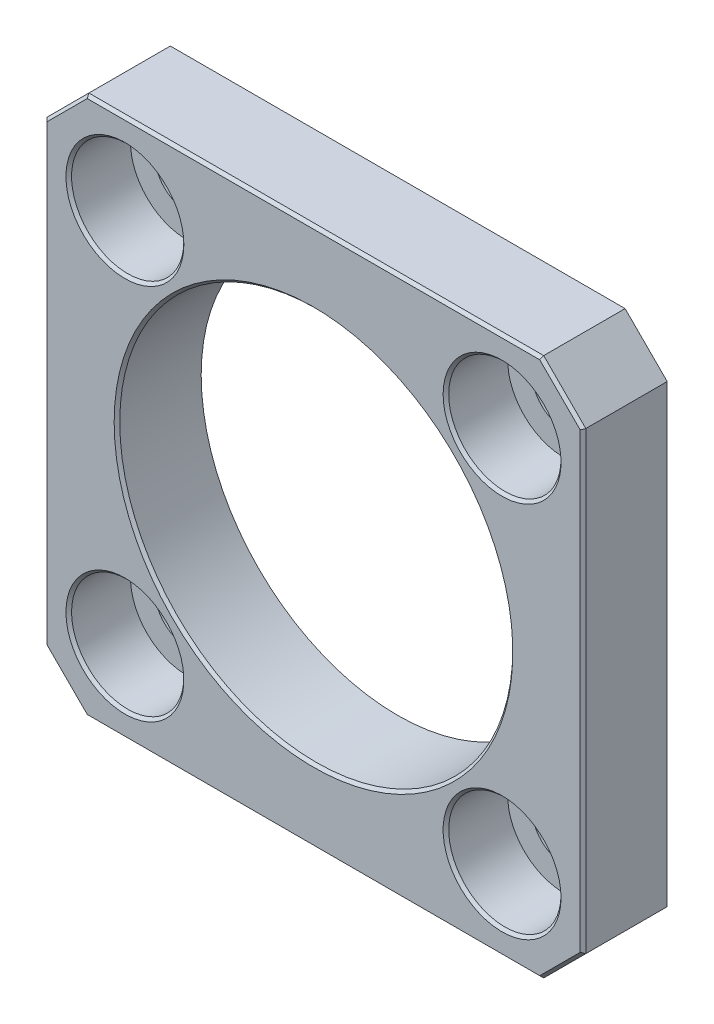
ISO-10303-21;
HEADER;
FILE_DESCRIPTION(('STEP AP214'),'2;1');
FILE_NAME('part.step','',(''),(''),'','','');
FILE_SCHEMA(('AUTOMOTIVE_DESIGN { 1 0 10303 214 1 1 1 1 }'));
ENDSEC;
DATA;
#1=APPLICATION_CONTEXT('core data for automotive mechanical design processes');
#2=APPLICATION_PROTOCOL_DEFINITION('international standard','automotive_design',2000,#1);
#3=PRODUCT_CONTEXT('',#1,'mechanical');
#4=PRODUCT('Part','Part','',(#3));
#5=PRODUCT_RELATED_PRODUCT_CATEGORY('part','',(#4));
#6=PRODUCT_DEFINITION_FORMATION('','',#4);
#7=PRODUCT_DEFINITION_CONTEXT('part definition',#1,'design');
#8=PRODUCT_DEFINITION('design','',#6,#7);
#9=PRODUCT_DEFINITION_SHAPE('','',#8);
#10=(LENGTH_UNIT() NAMED_UNIT(*) SI_UNIT(.MILLI.,.METRE.));
#11=(NAMED_UNIT(*) PLANE_ANGLE_UNIT() SI_UNIT($,.RADIAN.));
#12=(NAMED_UNIT(*) SI_UNIT($,.STERADIAN.) SOLID_ANGLE_UNIT());
#13=UNCERTAINTY_MEASURE_WITH_UNIT(LENGTH_MEASURE(1.E-05),#10,'distance_accuracy_value','');
#14=(GEOMETRIC_REPRESENTATION_CONTEXT(3) GLOBAL_UNCERTAINTY_ASSIGNED_CONTEXT((#13)) GLOBAL_UNIT_ASSIGNED_CONTEXT((#10,
#11,#12)) REPRESENTATION_CONTEXT('',''));
#15=CARTESIAN_POINT('',(0.,0.,0.));
#16=DIRECTION('',(0.,0.,1.));
#17=DIRECTION('',(1.,0.,0.));
#18=AXIS2_PLACEMENT_3D('',#15,#16,#17);
#19=CARTESIAN_POINT('',(0.,0.,6.));
#20=DIRECTION('',(0.,0.,-1.));
#21=DIRECTION('',(-1.,0.,0.));
#22=AXIS2_PLACEMENT_3D('',#19,#20,#21);
#23=PLANE('',#22);
#24=CARTESIAN_POINT('',(0.,0.,6.));
#25=DIRECTION('',(0.,0.,-1.));
#26=DIRECTION('',(-1.,0.,0.));
#27=AXIS2_PLACEMENT_3D('',#24,#25,#26);
#28=CIRCLE('',#27,14.2);
#29=CARTESIAN_POINT('',(-14.2,0.,6.));
#30=VERTEX_POINT('',#29);
#31=EDGE_CURVE('E222',#30,#30,#28,.T.);
#32=ORIENTED_EDGE('',*,*,#31,.T.);
#33=EDGE_LOOP('',(#32));
#34=FACE_BOUND('',#33,.T.);
#35=CARTESIAN_POINT('',(13.4350288425443,13.4350288425445,6.));
#36=DIRECTION('',(0.,0.,-1.));
#37=DIRECTION('',(-1.,0.,0.));
#38=AXIS2_PLACEMENT_3D('',#35,#36,#37);
#39=CIRCLE('',#38,4.19999999999998);
#40=CARTESIAN_POINT('',(9.23502884254428,13.4350288425445,6.));
#41=VERTEX_POINT('',#40);
#42=EDGE_CURVE('E219',#41,#41,#39,.T.);
#43=ORIENTED_EDGE('',*,*,#42,.T.);
#44=EDGE_LOOP('',(#43));
#45=FACE_BOUND('',#44,.T.);
#46=CARTESIAN_POINT('',(13.4350288425444,-13.4350288425444,6.));
#47=DIRECTION('',(0.,0.,-1.));
#48=DIRECTION('',(-1.,0.,0.));
#49=AXIS2_PLACEMENT_3D('',#46,#47,#48);
#50=CIRCLE('',#49,4.19999999999999);
#51=CARTESIAN_POINT('',(17.6350288425444,-13.4350288425444,6.));
#52=VERTEX_POINT('',#51);
#53=EDGE_CURVE('E216',#52,#52,#50,.T.);
#54=ORIENTED_EDGE('',*,*,#53,.T.);
#55=EDGE_LOOP('',(#54));
#56=FACE_BOUND('',#55,.T.);
#57=CARTESIAN_POINT('',(-13.4350288425444,-13.4350288425445,6.));
#58=DIRECTION('',(0.,0.,-1.));
#59=DIRECTION('',(-1.,0.,0.));
#60=AXIS2_PLACEMENT_3D('',#57,#58,#59);
#61=CIRCLE('',#60,4.19999999999998);
#62=CARTESIAN_POINT('',(-17.6350288425443,-13.4350288425445,6.));
#63=VERTEX_POINT('',#62);
#64=EDGE_CURVE('E213',#63,#63,#61,.T.);
#65=ORIENTED_EDGE('',*,*,#64,.T.);
#66=EDGE_LOOP('',(#65));
#67=FACE_BOUND('',#66,.T.);
#68=CARTESIAN_POINT('',(-13.4350288425444,13.4350288425444,6.));
#69=DIRECTION('',(0.,0.,-1.));
#70=DIRECTION('',(-1.,0.,0.));
#71=AXIS2_PLACEMENT_3D('',#68,#69,#70);
#72=CIRCLE('',#71,4.19999999999999);
#73=CARTESIAN_POINT('',(-9.23502884254442,13.4350288425444,6.));
#74=VERTEX_POINT('',#73);
#75=EDGE_CURVE('E210',#74,#74,#72,.T.);
#76=ORIENTED_EDGE('',*,*,#75,.T.);
#77=EDGE_LOOP('',(#76));
#78=FACE_BOUND('',#77,.T.);
#79=DIRECTION('',(0.,-1.,0.));
#80=VECTOR('',#79,1.);
#81=CARTESIAN_POINT('',(-19.,0.,6.));
#82=LINE('',#81,#80);
#83=CARTESIAN_POINT('',(-19.,16.1171572875254,6.));
#84=VERTEX_POINT('',#83);
#85=CARTESIAN_POINT('',(-19.,-16.1171572875254,6.));
#86=VERTEX_POINT('',#85);
#87=EDGE_CURVE('E205',#84,#86,#82,.T.);
#88=ORIENTED_EDGE('',*,*,#87,.T.);
#89=DIRECTION('',(0.707106781186548,-0.707106781186548,0.));
#90=VECTOR('',#89,1.);
#91=CARTESIAN_POINT('',(-17.5585786437627,-17.5585786437627,6.));
#92=LINE('',#91,#90);
#93=CARTESIAN_POINT('',(-16.1171572875254,-19.,6.));
#94=VERTEX_POINT('',#93);
#95=EDGE_CURVE('E207',#86,#94,#92,.T.);
#96=ORIENTED_EDGE('',*,*,#95,.T.);
#97=DIRECTION('',(1.,0.,0.));
#98=VECTOR('',#97,1.);
#99=CARTESIAN_POINT('',(0.,-19.,6.));
#100=LINE('',#99,#98);
#101=CARTESIAN_POINT('',(16.1171572875254,-19.,6.));
#102=VERTEX_POINT('',#101);
#103=EDGE_CURVE('E201',#94,#102,#100,.T.);
#104=ORIENTED_EDGE('',*,*,#103,.T.);
#105=DIRECTION('',(0.707106781186548,0.707106781186548,0.));
#106=VECTOR('',#105,1.);
#107=CARTESIAN_POINT('',(17.5585786437627,-17.5585786437627,6.));
#108=LINE('',#107,#106);
#109=CARTESIAN_POINT('',(19.,-16.1171572875254,6.));
#110=VERTEX_POINT('',#109);
#111=EDGE_CURVE('E199',#102,#110,#108,.T.);
#112=ORIENTED_EDGE('',*,*,#111,.T.);
#113=DIRECTION('',(0.,1.,0.));
#114=VECTOR('',#113,1.);
#115=CARTESIAN_POINT('',(19.,0.,6.));
#116=LINE('',#115,#114);
#117=CARTESIAN_POINT('',(19.,16.1171572875254,6.));
#118=VERTEX_POINT('',#117);
#119=EDGE_CURVE('E197',#110,#118,#116,.T.);
#120=ORIENTED_EDGE('',*,*,#119,.T.);
#121=DIRECTION('',(-0.707106781186548,0.707106781186548,0.));
#122=VECTOR('',#121,1.);
#123=CARTESIAN_POINT('',(17.5585786437627,17.5585786437627,6.));
#124=LINE('',#123,#122);
#125=CARTESIAN_POINT('',(16.1171572875254,19.,6.));
#126=VERTEX_POINT('',#125);
#127=EDGE_CURVE('E195',#118,#126,#124,.T.);
#128=ORIENTED_EDGE('',*,*,#127,.T.);
#129=DIRECTION('',(-1.,0.,0.));
#130=VECTOR('',#129,1.);
#131=CARTESIAN_POINT('',(0.,19.,6.));
#132=LINE('',#131,#130);
#133=CARTESIAN_POINT('',(-16.1171572875254,19.,6.));
#134=VERTEX_POINT('',#133);
#135=EDGE_CURVE('E193',#126,#134,#132,.T.);
#136=ORIENTED_EDGE('',*,*,#135,.T.);
#137=DIRECTION('',(-0.707106781186548,-0.707106781186548,0.));
#138=VECTOR('',#137,1.);
#139=CARTESIAN_POINT('',(-17.5585786437627,17.5585786437627,6.));
#140=LINE('',#139,#138);
#141=EDGE_CURVE('E203',#134,#84,#140,.T.);
#142=ORIENTED_EDGE('',*,*,#141,.T.);
#143=EDGE_LOOP('',(#88,#96,#104,#112,#120,#128,#136,#142));
#144=FACE_BOUND('',#143,.T.);
#145=ADVANCED_FACE('F39',(#34,#45,#56,#67,#78,#144),#23,.F.);
#146=CARTESIAN_POINT('',(0.,0.,0.));
#147=DIRECTION('',(0.,0.,-1.));
#148=DIRECTION('',(-1.,0.,0.));
#149=AXIS2_PLACEMENT_3D('',#146,#147,#148);
#150=PLANE('',#149);
#151=CARTESIAN_POINT('',(13.4350288425443,13.4350288425445,0.));
#152=DIRECTION('',(0.,0.,1.));
#153=DIRECTION('',(1.,0.,0.));
#154=AXIS2_PLACEMENT_3D('',#151,#152,#153);
#155=CIRCLE('',#154,2.25);
#156=CARTESIAN_POINT('',(15.6850288425443,13.4350288425445,0.));
#157=VERTEX_POINT('',#156);
#158=EDGE_CURVE('E281',#157,#157,#155,.T.);
#159=ORIENTED_EDGE('',*,*,#158,.T.);
#160=EDGE_LOOP('',(#159));
#161=FACE_BOUND('',#160,.T.);
#162=CARTESIAN_POINT('',(13.4350288425444,-13.4350288425444,0.));
#163=DIRECTION('',(0.,0.,1.));
#164=DIRECTION('',(1.,0.,0.));
#165=AXIS2_PLACEMENT_3D('',#162,#163,#164);
#166=CIRCLE('',#165,2.25);
#167=CARTESIAN_POINT('',(15.6850288425444,-13.4350288425444,0.));
#168=VERTEX_POINT('',#167);
#169=EDGE_CURVE('E292',#168,#168,#166,.T.);
#170=ORIENTED_EDGE('',*,*,#169,.T.);
#171=EDGE_LOOP('',(#170));
#172=FACE_BOUND('',#171,.T.);
#173=CARTESIAN_POINT('',(-13.4350288425444,-13.4350288425445,0.));
#174=DIRECTION('',(0.,0.,1.));
#175=DIRECTION('',(1.,0.,0.));
#176=AXIS2_PLACEMENT_3D('',#173,#174,#175);
#177=CIRCLE('',#176,2.25);
#178=CARTESIAN_POINT('',(-11.1850288425444,-13.4350288425445,0.));
#179=VERTEX_POINT('',#178);
#180=EDGE_CURVE('E301',#179,#179,#177,.T.);
#181=ORIENTED_EDGE('',*,*,#180,.T.);
#182=EDGE_LOOP('',(#181));
#183=FACE_BOUND('',#182,.T.);
#184=CARTESIAN_POINT('',(-13.4350288425444,13.4350288425444,0.));
#185=DIRECTION('',(0.,0.,1.));
#186=DIRECTION('',(1.,0.,0.));
#187=AXIS2_PLACEMENT_3D('',#184,#185,#186);
#188=CIRCLE('',#187,2.25);
#189=CARTESIAN_POINT('',(-11.1850288425444,13.4350288425444,0.));
#190=VERTEX_POINT('',#189);
#191=EDGE_CURVE('E160',#190,#190,#188,.T.);
#192=ORIENTED_EDGE('',*,*,#191,.T.);
#193=EDGE_LOOP('',(#192));
#194=FACE_BOUND('',#193,.T.);
#195=DIRECTION('',(0.,-1.,0.));
#196=VECTOR('',#195,1.);
#197=CARTESIAN_POINT('',(-19.2,-16.2,0.));
#198=LINE('',#197,#196);
#199=CARTESIAN_POINT('',(-19.2,16.2,0.));
#200=VERTEX_POINT('',#199);
#201=CARTESIAN_POINT('',(-19.2,-16.2,0.));
#202=VERTEX_POINT('',#201);
#203=EDGE_CURVE('E148',#200,#202,#198,.T.);
#204=ORIENTED_EDGE('',*,*,#203,.F.);
#205=DIRECTION('',(-0.707106781186548,-0.707106781186548,0.));
#206=VECTOR('',#205,1.);
#207=CARTESIAN_POINT('',(-19.2,16.2,0.));
#208=LINE('',#207,#206);
#209=CARTESIAN_POINT('',(-16.2,19.2,0.));
#210=VERTEX_POINT('',#209);
#211=EDGE_CURVE('E177',#210,#200,#208,.T.);
#212=ORIENTED_EDGE('',*,*,#211,.F.);
#213=DIRECTION('',(-1.,0.,0.));
#214=VECTOR('',#213,1.);
#215=CARTESIAN_POINT('',(-16.2,19.2,0.));
#216=LINE('',#215,#214);
#217=CARTESIAN_POINT('',(16.2,19.2,0.));
#218=VERTEX_POINT('',#217);
#219=EDGE_CURVE('E174',#218,#210,#216,.T.);
#220=ORIENTED_EDGE('',*,*,#219,.F.);
#221=DIRECTION('',(-0.707106781186548,0.707106781186548,0.));
#222=VECTOR('',#221,1.);
#223=CARTESIAN_POINT('',(16.2,19.2,0.));
#224=LINE('',#223,#222);
#225=CARTESIAN_POINT('',(19.2,16.2,0.));
#226=VERTEX_POINT('',#225);
#227=EDGE_CURVE('E171',#226,#218,#224,.T.);
#228=ORIENTED_EDGE('',*,*,#227,.F.);
#229=DIRECTION('',(0.,1.,0.));
#230=VECTOR('',#229,1.);
#231=CARTESIAN_POINT('',(19.2,-16.2,0.));
#232=LINE('',#231,#230);
#233=CARTESIAN_POINT('',(19.2,-16.2,0.));
#234=VERTEX_POINT('',#233);
#235=EDGE_CURVE('E168',#234,#226,#232,.T.);
#236=ORIENTED_EDGE('',*,*,#235,.F.);
#237=DIRECTION('',(0.707106781186548,0.707106781186548,0.));
#238=VECTOR('',#237,1.);
#239=CARTESIAN_POINT('',(16.2,-19.2,0.));
#240=LINE('',#239,#238);
#241=CARTESIAN_POINT('',(16.2,-19.2,0.));
#242=VERTEX_POINT('',#241);
#243=EDGE_CURVE('E165',#242,#234,#240,.T.);
#244=ORIENTED_EDGE('',*,*,#243,.F.);
#245=DIRECTION('',(1.,0.,0.));
#246=VECTOR('',#245,1.);
#247=CARTESIAN_POINT('',(-16.2,-19.2,0.));
#248=LINE('',#247,#246);
#249=CARTESIAN_POINT('',(-16.2,-19.2,0.));
#250=VERTEX_POINT('',#249);
#251=EDGE_CURVE('E151',#250,#242,#248,.T.);
#252=ORIENTED_EDGE('',*,*,#251,.F.);
#253=DIRECTION('',(0.707106781186548,-0.707106781186548,0.));
#254=VECTOR('',#253,1.);
#255=CARTESIAN_POINT('',(-16.2,-19.2,0.));
#256=LINE('',#255,#254);
#257=EDGE_CURVE('E134',#202,#250,#256,.T.);
#258=ORIENTED_EDGE('',*,*,#257,.F.);
#259=EDGE_LOOP('',(#204,#212,#220,#228,#236,#244,#252,#258));
#260=FACE_BOUND('',#259,.T.);
#261=CARTESIAN_POINT('',(0.,0.,0.));
#262=DIRECTION('',(0.,0.,1.));
#263=DIRECTION('',(1.,0.,0.));
#264=AXIS2_PLACEMENT_3D('',#261,#262,#263);
#265=CIRCLE('',#264,14.);
#266=CARTESIAN_POINT('',(14.,0.,0.));
#267=VERTEX_POINT('',#266);
#268=EDGE_CURVE('E157',#267,#267,#265,.T.);
#269=ORIENTED_EDGE('',*,*,#268,.T.);
#270=EDGE_LOOP('',(#269));
#271=FACE_BOUND('',#270,.T.);
#272=ADVANCED_FACE('F145',(#161,#172,#183,#194,#260,#271),#150,.T.);
#273=CARTESIAN_POINT('',(-19.2,-16.2,6.));
#274=DIRECTION('',(1.,0.,0.));
#275=DIRECTION('',(0.,0.,-1.));
#276=AXIS2_PLACEMENT_3D('',#273,#274,#275);
#277=PLANE('',#276);
#278=DIRECTION('',(0.,0.,-1.));
#279=VECTOR('',#278,1.);
#280=CARTESIAN_POINT('',(-19.2,-16.2,6.));
#281=LINE('',#280,#279);
#282=CARTESIAN_POINT('',(-19.2,-16.2,5.8));
#283=VERTEX_POINT('',#282);
#284=EDGE_CURVE('E130',#283,#202,#281,.T.);
#285=ORIENTED_EDGE('',*,*,#284,.F.);
#286=DIRECTION('',(0.,1.,0.));
#287=VECTOR('',#286,1.);
#288=CARTESIAN_POINT('',(-19.2,-16.2,5.8));
#289=LINE('',#288,#287);
#290=CARTESIAN_POINT('',(-19.2,16.2,5.8));
#291=VERTEX_POINT('',#290);
#292=EDGE_CURVE('E238',#283,#291,#289,.T.);
#293=ORIENTED_EDGE('',*,*,#292,.T.);
#294=DIRECTION('',(0.,0.,-1.));
#295=VECTOR('',#294,1.);
#296=CARTESIAN_POINT('',(-19.2,16.2,6.));
#297=LINE('',#296,#295);
#298=EDGE_CURVE('E155',#291,#200,#297,.T.);
#299=ORIENTED_EDGE('',*,*,#298,.T.);
#300=ORIENTED_EDGE('',*,*,#203,.T.);
#301=EDGE_LOOP('',(#285,#293,#299,#300));
#302=FACE_BOUND('',#301,.T.);
#303=ADVANCED_FACE('F153',(#302),#277,.F.);
#304=CARTESIAN_POINT('',(-16.2,-19.2,6.));
#305=DIRECTION('',(0.707106781186547,0.707106781186547,0.));
#306=DIRECTION('',(-0.707106781186548,0.707106781186548,0.));
#307=AXIS2_PLACEMENT_3D('',#304,#305,#306);
#308=PLANE('',#307);
#309=DIRECTION('',(0.,0.,-1.));
#310=VECTOR('',#309,1.);
#311=CARTESIAN_POINT('',(-16.2,-19.2,6.));
#312=LINE('',#311,#310);
#313=CARTESIAN_POINT('',(-16.2,-19.2,5.8));
#314=VERTEX_POINT('',#313);
#315=EDGE_CURVE('E141',#314,#250,#312,.T.);
#316=ORIENTED_EDGE('',*,*,#315,.F.);
#317=DIRECTION('',(-0.707106781186548,0.707106781186548,0.));
#318=VECTOR('',#317,1.);
#319=CARTESIAN_POINT('',(-16.2,-19.2,5.8));
#320=LINE('',#319,#318);
#321=EDGE_CURVE('E137',#314,#283,#320,.T.);
#322=ORIENTED_EDGE('',*,*,#321,.T.);
#323=ORIENTED_EDGE('',*,*,#284,.T.);
#324=ORIENTED_EDGE('',*,*,#257,.T.);
#325=EDGE_LOOP('',(#316,#322,#323,#324));
#326=FACE_BOUND('',#325,.T.);
#327=ADVANCED_FACE('F133',(#326),#308,.F.);
#328=CARTESIAN_POINT('',(-16.2,-19.2,6.));
#329=DIRECTION('',(0.,1.,0.));
#330=DIRECTION('',(0.,0.,1.));
#331=AXIS2_PLACEMENT_3D('',#328,#329,#330);
#332=PLANE('',#331);
#333=DIRECTION('',(0.,0.,-1.));
#334=VECTOR('',#333,1.);
#335=CARTESIAN_POINT('',(16.2,-19.2,6.));
#336=LINE('',#335,#334);
#337=CARTESIAN_POINT('',(16.2,-19.2,5.8));
#338=VERTEX_POINT('',#337);
#339=EDGE_CURVE('E188',#338,#242,#336,.T.);
#340=ORIENTED_EDGE('',*,*,#339,.F.);
#341=DIRECTION('',(-1.,0.,0.));
#342=VECTOR('',#341,1.);
#343=CARTESIAN_POINT('',(-16.2,-19.2,5.8));
#344=LINE('',#343,#342);
#345=EDGE_CURVE('E242',#338,#314,#344,.T.);
#346=ORIENTED_EDGE('',*,*,#345,.T.);
#347=ORIENTED_EDGE('',*,*,#315,.T.);
#348=ORIENTED_EDGE('',*,*,#251,.T.);
#349=EDGE_LOOP('',(#340,#346,#347,#348));
#350=FACE_BOUND('',#349,.T.);
#351=ADVANCED_FACE('F369',(#350),#332,.F.);
#352=CARTESIAN_POINT('',(16.2,-19.2,6.));
#353=DIRECTION('',(-0.707106781186547,0.707106781186547,0.));
#354=DIRECTION('',(-0.707106781186548,-0.707106781186548,0.));
#355=AXIS2_PLACEMENT_3D('',#352,#353,#354);
#356=PLANE('',#355);
#357=DIRECTION('',(0.,0.,-1.));
#358=VECTOR('',#357,1.);
#359=CARTESIAN_POINT('',(19.2,-16.2,6.));
#360=LINE('',#359,#358);
#361=CARTESIAN_POINT('',(19.2,-16.2,5.8));
#362=VERTEX_POINT('',#361);
#363=EDGE_CURVE('E186',#362,#234,#360,.T.);
#364=ORIENTED_EDGE('',*,*,#363,.F.);
#365=DIRECTION('',(-0.707106781186548,-0.707106781186548,0.));
#366=VECTOR('',#365,1.);
#367=CARTESIAN_POINT('',(16.2,-19.2,5.8));
#368=LINE('',#367,#366);
#369=EDGE_CURVE('E244',#362,#338,#368,.T.);
#370=ORIENTED_EDGE('',*,*,#369,.T.);
#371=ORIENTED_EDGE('',*,*,#339,.T.);
#372=ORIENTED_EDGE('',*,*,#243,.T.);
#373=EDGE_LOOP('',(#364,#370,#371,#372));
#374=FACE_BOUND('',#373,.T.);
#375=ADVANCED_FACE('F365',(#374),#356,.F.);
#376=CARTESIAN_POINT('',(19.2,-16.2,6.));
#377=DIRECTION('',(-1.,0.,0.));
#378=DIRECTION('',(0.,0.,1.));
#379=AXIS2_PLACEMENT_3D('',#376,#377,#378);
#380=PLANE('',#379);
#381=DIRECTION('',(0.,0.,-1.));
#382=VECTOR('',#381,1.);
#383=CARTESIAN_POINT('',(19.2,16.2,6.));
#384=LINE('',#383,#382);
#385=CARTESIAN_POINT('',(19.2,16.2,5.8));
#386=VERTEX_POINT('',#385);
#387=EDGE_CURVE('E184',#386,#226,#384,.T.);
#388=ORIENTED_EDGE('',*,*,#387,.F.);
#389=DIRECTION('',(0.,-1.,0.));
#390=VECTOR('',#389,1.);
#391=CARTESIAN_POINT('',(19.2,-16.2,5.8));
#392=LINE('',#391,#390);
#393=EDGE_CURVE('E246',#386,#362,#392,.T.);
#394=ORIENTED_EDGE('',*,*,#393,.T.);
#395=ORIENTED_EDGE('',*,*,#363,.T.);
#396=ORIENTED_EDGE('',*,*,#235,.T.);
#397=EDGE_LOOP('',(#388,#394,#395,#396));
#398=FACE_BOUND('',#397,.T.);
#399=ADVANCED_FACE('F362',(#398),#380,.F.);
#400=CARTESIAN_POINT('',(16.2,19.2,6.));
#401=DIRECTION('',(-0.707106781186547,-0.707106781186547,0.));
#402=DIRECTION('',(0.707106781186548,-0.707106781186548,0.));
#403=AXIS2_PLACEMENT_3D('',#400,#401,#402);
#404=PLANE('',#403);
#405=DIRECTION('',(0.,0.,-1.));
#406=VECTOR('',#405,1.);
#407=CARTESIAN_POINT('',(16.2,19.2,6.));
#408=LINE('',#407,#406);
#409=CARTESIAN_POINT('',(16.2,19.2,5.8));
#410=VERTEX_POINT('',#409);
#411=EDGE_CURVE('E182',#410,#218,#408,.T.);
#412=ORIENTED_EDGE('',*,*,#411,.F.);
#413=DIRECTION('',(0.707106781186548,-0.707106781186548,0.));
#414=VECTOR('',#413,1.);
#415=CARTESIAN_POINT('',(16.2,19.2,5.8));
#416=LINE('',#415,#414);
#417=EDGE_CURVE('E49',#410,#386,#416,.T.);
#418=ORIENTED_EDGE('',*,*,#417,.T.);
#419=ORIENTED_EDGE('',*,*,#387,.T.);
#420=ORIENTED_EDGE('',*,*,#227,.T.);
#421=EDGE_LOOP('',(#412,#418,#419,#420));
#422=FACE_BOUND('',#421,.T.);
#423=ADVANCED_FACE('F359',(#422),#404,.F.);
#424=CARTESIAN_POINT('',(-16.2,19.2,6.));
#425=DIRECTION('',(0.,-1.,0.));
#426=DIRECTION('',(0.,0.,-1.));
#427=AXIS2_PLACEMENT_3D('',#424,#425,#426);
#428=PLANE('',#427);
#429=DIRECTION('',(0.,0.,-1.));
#430=VECTOR('',#429,1.);
#431=CARTESIAN_POINT('',(-16.2,19.2,6.));
#432=LINE('',#431,#430);
#433=CARTESIAN_POINT('',(-16.2,19.2,5.8));
#434=VERTEX_POINT('',#433);
#435=EDGE_CURVE('E180',#434,#210,#432,.T.);
#436=ORIENTED_EDGE('',*,*,#435,.F.);
#437=DIRECTION('',(1.,0.,0.));
#438=VECTOR('',#437,1.);
#439=CARTESIAN_POINT('',(-16.2,19.2,5.8));
#440=LINE('',#439,#438);
#441=EDGE_CURVE('E11',#434,#410,#440,.T.);
#442=ORIENTED_EDGE('',*,*,#441,.T.);
#443=ORIENTED_EDGE('',*,*,#411,.T.);
#444=ORIENTED_EDGE('',*,*,#219,.T.);
#445=EDGE_LOOP('',(#436,#442,#443,#444));
#446=FACE_BOUND('',#445,.T.);
#447=ADVANCED_FACE('F355',(#446),#428,.F.);
#448=CARTESIAN_POINT('',(-19.2,16.2,6.));
#449=DIRECTION('',(0.707106781186547,-0.707106781186547,0.));
#450=DIRECTION('',(0.707106781186548,0.707106781186548,0.));
#451=AXIS2_PLACEMENT_3D('',#448,#449,#450);
#452=PLANE('',#451);
#453=ORIENTED_EDGE('',*,*,#298,.F.);
#454=DIRECTION('',(0.707106781186548,0.707106781186548,0.));
#455=VECTOR('',#454,1.);
#456=CARTESIAN_POINT('',(-19.2,16.2,5.8));
#457=LINE('',#456,#455);
#458=EDGE_CURVE('E240',#291,#434,#457,.T.);
#459=ORIENTED_EDGE('',*,*,#458,.T.);
#460=ORIENTED_EDGE('',*,*,#435,.T.);
#461=ORIENTED_EDGE('',*,*,#211,.T.);
#462=EDGE_LOOP('',(#453,#459,#460,#461));
#463=FACE_BOUND('',#462,.T.);
#464=ADVANCED_FACE('F352',(#463),#452,.F.);
#465=CARTESIAN_POINT('',(0.,0.,6.));
#466=DIRECTION('',(0.,0.,-1.));
#467=DIRECTION('',(-1.,0.,0.));
#468=AXIS2_PLACEMENT_3D('',#465,#466,#467);
#469=CYLINDRICAL_SURFACE('',#468,14.);
#470=CARTESIAN_POINT('',(0.,0.,5.80000000000002));
#471=DIRECTION('',(0.,0.,-1.));
#472=DIRECTION('',(-1.,0.,0.));
#473=AXIS2_PLACEMENT_3D('',#470,#471,#472);
#474=CIRCLE('',#473,14.);
#475=CARTESIAN_POINT('',(-14.,0.,5.80000000000002));
#476=VERTEX_POINT('',#475);
#477=EDGE_CURVE('E140',#476,#476,#474,.F.);
#478=ORIENTED_EDGE('',*,*,#477,.T.);
#479=EDGE_LOOP('',(#478));
#480=FACE_BOUND('',#479,.T.);
#481=ORIENTED_EDGE('',*,*,#268,.F.);
#482=EDGE_LOOP('',(#481));
#483=FACE_BOUND('',#482,.T.);
#484=ADVANCED_FACE('F317',(#480,#483),#469,.F.);
#485=CARTESIAN_POINT('',(-13.4350288425444,13.4350288425444,6.));
#486=DIRECTION('',(0.,0.,1.));
#487=DIRECTION('',(1.,0.,0.));
#488=AXIS2_PLACEMENT_3D('',#485,#486,#487);
#489=CYLINDRICAL_SURFACE('',#488,2.25);
#490=ORIENTED_EDGE('',*,*,#191,.F.);
#491=EDGE_LOOP('',(#490));
#492=FACE_BOUND('',#491,.T.);
#493=CARTESIAN_POINT('',(-13.4350288425444,13.4350288425444,1.6));
#494=DIRECTION('',(0.,0.,1.));
#495=DIRECTION('',(1.,0.,0.));
#496=AXIS2_PLACEMENT_3D('',#493,#494,#495);
#497=CIRCLE('',#496,2.25);
#498=CARTESIAN_POINT('',(-11.1850288425444,13.4350288425444,1.6));
#499=VERTEX_POINT('',#498);
#500=EDGE_CURVE('E307',#499,#499,#497,.T.);
#501=ORIENTED_EDGE('',*,*,#500,.T.);
#502=EDGE_LOOP('',(#501));
#503=FACE_BOUND('',#502,.T.);
#504=ADVANCED_FACE('F313',(#492,#503),#489,.F.);
#505=CARTESIAN_POINT('',(-11.1850288425444,13.4350288425444,1.6));
#506=DIRECTION('',(0.,0.,-1.));
#507=DIRECTION('',(-1.,0.,0.));
#508=AXIS2_PLACEMENT_3D('',#505,#506,#507);
#509=PLANE('',#508);
#510=ORIENTED_EDGE('',*,*,#500,.F.);
#511=EDGE_LOOP('',(#510));
#512=FACE_BOUND('',#511,.T.);
#513=CARTESIAN_POINT('',(-13.4350288425444,13.4350288425444,1.6));
#514=DIRECTION('',(0.,0.,1.));
#515=DIRECTION('',(1.,0.,0.));
#516=AXIS2_PLACEMENT_3D('',#513,#514,#515);
#517=CIRCLE('',#516,4.);
#518=CARTESIAN_POINT('',(-9.43502884254441,13.4350288425444,1.6));
#519=VERTEX_POINT('',#518);
#520=EDGE_CURVE('E304',#519,#519,#517,.T.);
#521=ORIENTED_EDGE('',*,*,#520,.T.);
#522=EDGE_LOOP('',(#521));
#523=FACE_BOUND('',#522,.T.);
#524=ADVANCED_FACE('F316',(#512,#523),#509,.F.);
#525=CARTESIAN_POINT('',(-13.4350288425444,13.4350288425444,6.));
#526=DIRECTION('',(0.,0.,1.));
#527=DIRECTION('',(1.,0.,0.));
#528=AXIS2_PLACEMENT_3D('',#525,#526,#527);
#529=CYLINDRICAL_SURFACE('',#528,3.99999999999999);
#530=CARTESIAN_POINT('',(-13.4350288425444,13.4350288425444,5.80000000000001));
#531=DIRECTION('',(0.,0.,-1.));
#532=DIRECTION('',(-1.,0.,0.));
#533=AXIS2_PLACEMENT_3D('',#530,#531,#532);
#534=CIRCLE('',#533,3.99999999999999);
#535=CARTESIAN_POINT('',(-9.43502884254441,13.4350288425444,5.80000000000001));
#536=VERTEX_POINT('',#535);
#537=EDGE_CURVE('E234',#536,#536,#534,.F.);
#538=ORIENTED_EDGE('',*,*,#537,.T.);
#539=EDGE_LOOP('',(#538));
#540=FACE_BOUND('',#539,.T.);
#541=ORIENTED_EDGE('',*,*,#520,.F.);
#542=EDGE_LOOP('',(#541));
#543=FACE_BOUND('',#542,.T.);
#544=ADVANCED_FACE('F323',(#540,#543),#529,.F.);
#545=CARTESIAN_POINT('',(-13.4350288425444,-13.4350288425445,6.));
#546=DIRECTION('',(0.,0.,1.));
#547=DIRECTION('',(1.,0.,0.));
#548=AXIS2_PLACEMENT_3D('',#545,#546,#547);
#549=CYLINDRICAL_SURFACE('',#548,2.25);
#550=ORIENTED_EDGE('',*,*,#180,.F.);
#551=EDGE_LOOP('',(#550));
#552=FACE_BOUND('',#551,.T.);
#553=CARTESIAN_POINT('',(-13.4350288425444,-13.4350288425445,1.6));
#554=DIRECTION('',(0.,0.,1.));
#555=DIRECTION('',(1.,0.,0.));
#556=AXIS2_PLACEMENT_3D('',#553,#554,#555);
#557=CIRCLE('',#556,2.25);
#558=CARTESIAN_POINT('',(-11.1850288425444,-13.4350288425445,1.6));
#559=VERTEX_POINT('',#558);
#560=EDGE_CURVE('E298',#559,#559,#557,.T.);
#561=ORIENTED_EDGE('',*,*,#560,.T.);
#562=EDGE_LOOP('',(#561));
#563=FACE_BOUND('',#562,.T.);
#564=ADVANCED_FACE('F328',(#552,#563),#549,.F.);
#565=CARTESIAN_POINT('',(-11.1850288425444,-13.4350288425445,1.6));
#566=DIRECTION('',(0.,0.,-1.));
#567=DIRECTION('',(-1.,0.,0.));
#568=AXIS2_PLACEMENT_3D('',#565,#566,#567);
#569=PLANE('',#568);
#570=ORIENTED_EDGE('',*,*,#560,.F.);
#571=EDGE_LOOP('',(#570));
#572=FACE_BOUND('',#571,.T.);
#573=CARTESIAN_POINT('',(-13.4350288425444,-13.4350288425445,1.6));
#574=DIRECTION('',(0.,0.,1.));
#575=DIRECTION('',(1.,0.,0.));
#576=AXIS2_PLACEMENT_3D('',#573,#574,#575);
#577=CIRCLE('',#576,4.);
#578=CARTESIAN_POINT('',(-9.43502884254436,-13.4350288425445,1.6));
#579=VERTEX_POINT('',#578);
#580=EDGE_CURVE('E295',#579,#579,#577,.T.);
#581=ORIENTED_EDGE('',*,*,#580,.T.);
#582=EDGE_LOOP('',(#581));
#583=FACE_BOUND('',#582,.T.);
#584=ADVANCED_FACE('F336',(#572,#583),#569,.F.);
#585=CARTESIAN_POINT('',(-13.4350288425444,-13.4350288425445,6.));
#586=DIRECTION('',(0.,0.,1.));
#587=DIRECTION('',(1.,0.,0.));
#588=AXIS2_PLACEMENT_3D('',#585,#586,#587);
#589=CYLINDRICAL_SURFACE('',#588,3.99999999999999);
#590=CARTESIAN_POINT('',(-13.4350288425444,-13.4350288425445,5.80000000000001));
#591=DIRECTION('',(0.,0.,-1.));
#592=DIRECTION('',(-1.,0.,0.));
#593=AXIS2_PLACEMENT_3D('',#590,#591,#592);
#594=CIRCLE('',#593,3.99999999999999);
#595=CARTESIAN_POINT('',(-17.4350288425444,-13.4350288425445,5.80000000000001));
#596=VERTEX_POINT('',#595);
#597=EDGE_CURVE('E231',#596,#596,#594,.F.);
#598=ORIENTED_EDGE('',*,*,#597,.T.);
#599=EDGE_LOOP('',(#598));
#600=FACE_BOUND('',#599,.T.);
#601=ORIENTED_EDGE('',*,*,#580,.F.);
#602=EDGE_LOOP('',(#601));
#603=FACE_BOUND('',#602,.T.);
#604=ADVANCED_FACE('F555',(#600,#603),#589,.F.);
#605=CARTESIAN_POINT('',(13.4350288425444,-13.4350288425444,6.));
#606=DIRECTION('',(0.,0.,1.));
#607=DIRECTION('',(1.,0.,0.));
#608=AXIS2_PLACEMENT_3D('',#605,#606,#607);
#609=CYLINDRICAL_SURFACE('',#608,2.25);
#610=ORIENTED_EDGE('',*,*,#169,.F.);
#611=EDGE_LOOP('',(#610));
#612=FACE_BOUND('',#611,.T.);
#613=CARTESIAN_POINT('',(13.4350288425444,-13.4350288425444,1.6));
#614=DIRECTION('',(0.,0.,1.));
#615=DIRECTION('',(1.,0.,0.));
#616=AXIS2_PLACEMENT_3D('',#613,#614,#615);
#617=CIRCLE('',#616,2.25);
#618=CARTESIAN_POINT('',(15.6850288425444,-13.4350288425444,1.6));
#619=VERTEX_POINT('',#618);
#620=EDGE_CURVE('E289',#619,#619,#617,.T.);
#621=ORIENTED_EDGE('',*,*,#620,.T.);
#622=EDGE_LOOP('',(#621));
#623=FACE_BOUND('',#622,.T.);
#624=ADVANCED_FACE('F548',(#612,#623),#609,.F.);
#625=CARTESIAN_POINT('',(15.6850288425444,-13.4350288425444,1.6));
#626=DIRECTION('',(0.,0.,-1.));
#627=DIRECTION('',(-1.,0.,0.));
#628=AXIS2_PLACEMENT_3D('',#625,#626,#627);
#629=PLANE('',#628);
#630=ORIENTED_EDGE('',*,*,#620,.F.);
#631=EDGE_LOOP('',(#630));
#632=FACE_BOUND('',#631,.T.);
#633=CARTESIAN_POINT('',(13.4350288425444,-13.4350288425444,1.6));
#634=DIRECTION('',(0.,0.,1.));
#635=DIRECTION('',(1.,0.,0.));
#636=AXIS2_PLACEMENT_3D('',#633,#634,#635);
#637=CIRCLE('',#636,4.);
#638=CARTESIAN_POINT('',(17.4350288425444,-13.4350288425444,1.6));
#639=VERTEX_POINT('',#638);
#640=EDGE_CURVE('E286',#639,#639,#637,.T.);
#641=ORIENTED_EDGE('',*,*,#640,.T.);
#642=EDGE_LOOP('',(#641));
#643=FACE_BOUND('',#642,.T.);
#644=ADVANCED_FACE('F539',(#632,#643),#629,.F.);
#645=CARTESIAN_POINT('',(13.4350288425444,-13.4350288425444,6.));
#646=DIRECTION('',(0.,0.,1.));
#647=DIRECTION('',(1.,0.,0.));
#648=AXIS2_PLACEMENT_3D('',#645,#646,#647);
#649=CYLINDRICAL_SURFACE('',#648,3.99999999999999);
#650=CARTESIAN_POINT('',(13.4350288425444,-13.4350288425444,5.80000000000001));
#651=DIRECTION('',(0.,0.,-1.));
#652=DIRECTION('',(-1.,0.,0.));
#653=AXIS2_PLACEMENT_3D('',#650,#651,#652);
#654=CIRCLE('',#653,3.99999999999999);
#655=CARTESIAN_POINT('',(17.4350288425444,-13.4350288425444,5.80000000000001));
#656=VERTEX_POINT('',#655);
#657=EDGE_CURVE('E228',#656,#656,#654,.F.);
#658=ORIENTED_EDGE('',*,*,#657,.T.);
#659=EDGE_LOOP('',(#658));
#660=FACE_BOUND('',#659,.T.);
#661=ORIENTED_EDGE('',*,*,#640,.F.);
#662=EDGE_LOOP('',(#661));
#663=FACE_BOUND('',#662,.T.);
#664=ADVANCED_FACE('F530',(#660,#663),#649,.F.);
#665=CARTESIAN_POINT('',(13.4350288425443,13.4350288425445,6.));
#666=DIRECTION('',(0.,0.,1.));
#667=DIRECTION('',(1.,0.,0.));
#668=AXIS2_PLACEMENT_3D('',#665,#666,#667);
#669=CYLINDRICAL_SURFACE('',#668,2.25);
#670=ORIENTED_EDGE('',*,*,#158,.F.);
#671=EDGE_LOOP('',(#670));
#672=FACE_BOUND('',#671,.T.);
#673=CARTESIAN_POINT('',(13.4350288425443,13.4350288425445,1.6));
#674=DIRECTION('',(0.,0.,1.));
#675=DIRECTION('',(1.,0.,0.));
#676=AXIS2_PLACEMENT_3D('',#673,#674,#675);
#677=CIRCLE('',#676,2.25);
#678=CARTESIAN_POINT('',(15.6850288425443,13.4350288425445,1.6));
#679=VERTEX_POINT('',#678);
#680=EDGE_CURVE('E276',#679,#679,#677,.T.);
#681=ORIENTED_EDGE('',*,*,#680,.T.);
#682=EDGE_LOOP('',(#681));
#683=FACE_BOUND('',#682,.T.);
#684=ADVANCED_FACE('F523',(#672,#683),#669,.F.);
#685=CARTESIAN_POINT('',(15.6850288425443,13.4350288425445,1.6));
#686=DIRECTION('',(0.,0.,-1.));
#687=DIRECTION('',(-1.,0.,0.));
#688=AXIS2_PLACEMENT_3D('',#685,#686,#687);
#689=PLANE('',#688);
#690=ORIENTED_EDGE('',*,*,#680,.F.);
#691=EDGE_LOOP('',(#690));
#692=FACE_BOUND('',#691,.T.);
#693=CARTESIAN_POINT('',(13.4350288425443,13.4350288425445,1.6));
#694=DIRECTION('',(0.,0.,1.));
#695=DIRECTION('',(1.,0.,0.));
#696=AXIS2_PLACEMENT_3D('',#693,#694,#695);
#697=CIRCLE('',#696,4.);
#698=CARTESIAN_POINT('',(17.4350288425443,13.4350288425445,1.6));
#699=VERTEX_POINT('',#698);
#700=EDGE_CURVE('E271',#699,#699,#697,.T.);
#701=ORIENTED_EDGE('',*,*,#700,.T.);
#702=EDGE_LOOP('',(#701));
#703=FACE_BOUND('',#702,.T.);
#704=ADVANCED_FACE('F513',(#692,#703),#689,.F.);
#705=CARTESIAN_POINT('',(13.4350288425443,13.4350288425445,6.));
#706=DIRECTION('',(0.,0.,1.));
#707=DIRECTION('',(1.,0.,0.));
#708=AXIS2_PLACEMENT_3D('',#705,#706,#707);
#709=CYLINDRICAL_SURFACE('',#708,3.99999999999999);
#710=CARTESIAN_POINT('',(13.4350288425443,13.4350288425445,5.80000000000001));
#711=DIRECTION('',(0.,0.,-1.));
#712=DIRECTION('',(-1.,0.,0.));
#713=AXIS2_PLACEMENT_3D('',#710,#711,#712);
#714=CIRCLE('',#713,3.99999999999999);
#715=CARTESIAN_POINT('',(9.43502884254427,13.4350288425445,5.80000000000001));
#716=VERTEX_POINT('',#715);
#717=EDGE_CURVE('E225',#716,#716,#714,.F.);
#718=ORIENTED_EDGE('',*,*,#717,.T.);
#719=EDGE_LOOP('',(#718));
#720=FACE_BOUND('',#719,.T.);
#721=ORIENTED_EDGE('',*,*,#700,.F.);
#722=EDGE_LOOP('',(#721));
#723=FACE_BOUND('',#722,.T.);
#724=ADVANCED_FACE('F385',(#720,#723),#709,.F.);
#725=CARTESIAN_POINT('',(0.,0.,5.80000000000002));
#726=DIRECTION('',(0.,0.,1.));
#727=DIRECTION('',(1.,0.,0.));
#728=AXIS2_PLACEMENT_3D('',#725,#726,#727);
#729=CONICAL_SURFACE('',#728,14.,0.785398163397435);
#730=ORIENTED_EDGE('',*,*,#31,.F.);
#731=EDGE_LOOP('',(#730));
#732=FACE_BOUND('',#731,.T.);
#733=ORIENTED_EDGE('',*,*,#477,.F.);
#734=EDGE_LOOP('',(#733));
#735=FACE_BOUND('',#734,.T.);
#736=ADVANCED_FACE('F378',(#732,#735),#729,.F.);
#737=CARTESIAN_POINT('',(13.4350288425443,13.4350288425445,5.80000000000001));
#738=DIRECTION('',(0.,0.,1.));
#739=DIRECTION('',(1.,0.,0.));
#740=AXIS2_PLACEMENT_3D('',#737,#738,#739);
#741=CONICAL_SURFACE('',#740,3.99999999999999,0.785398163397446);
#742=ORIENTED_EDGE('',*,*,#42,.F.);
#743=EDGE_LOOP('',(#742));
#744=FACE_BOUND('',#743,.T.);
#745=ORIENTED_EDGE('',*,*,#717,.F.);
#746=EDGE_LOOP('',(#745));
#747=FACE_BOUND('',#746,.T.);
#748=ADVANCED_FACE('F384',(#744,#747),#741,.F.);
#749=CARTESIAN_POINT('',(13.4350288425444,-13.4350288425444,5.80000000000001));
#750=DIRECTION('',(0.,0.,1.));
#751=DIRECTION('',(1.,0.,0.));
#752=AXIS2_PLACEMENT_3D('',#749,#750,#751);
#753=CONICAL_SURFACE('',#752,3.99999999999999,0.785398163397446);
#754=CARTESIAN_POINT('',(17.6350288425444,-13.4350288425444,6.));
#755=CARTESIAN_POINT('',(17.6329455092111,-13.4350288425444,5.99791666666667));
#756=CARTESIAN_POINT('',(17.6308621758777,-13.4350288425444,5.99583333333333));
#757=CARTESIAN_POINT('',(17.6266955092111,-13.4350288425444,5.99166666666667));
#758=CARTESIAN_POINT('',(17.6246121758777,-13.4350288425444,5.98958333333333));
#759=CARTESIAN_POINT('',(17.6204455092111,-13.4350288425444,5.98541666666667));
#760=CARTESIAN_POINT('',(17.6183621758777,-13.4350288425444,5.98333333333333));
#761=CARTESIAN_POINT('',(17.6141955092111,-13.4350288425444,5.97916666666667));
#762=CARTESIAN_POINT('',(17.6121121758777,-13.4350288425444,5.97708333333333));
#763=CARTESIAN_POINT('',(17.6079455092111,-13.4350288425444,5.97291666666667));
#764=CARTESIAN_POINT('',(17.6058621758777,-13.4350288425444,5.97083333333333));
#765=CARTESIAN_POINT('',(17.6016955092111,-13.4350288425444,5.96666666666667));
#766=CARTESIAN_POINT('',(17.5996121758777,-13.4350288425444,5.96458333333334));
#767=CARTESIAN_POINT('',(17.5954455092111,-13.4350288425444,5.96041666666667));
#768=CARTESIAN_POINT('',(17.5933621758777,-13.4350288425444,5.95833333333333));
#769=CARTESIAN_POINT('',(17.5891955092111,-13.4350288425444,5.95416666666667));
#770=CARTESIAN_POINT('',(17.5871121758777,-13.4350288425444,5.95208333333334));
#771=CARTESIAN_POINT('',(17.5829455092111,-13.4350288425444,5.94791666666667));
#772=CARTESIAN_POINT('',(17.5808621758777,-13.4350288425444,5.94583333333334));
#773=CARTESIAN_POINT('',(17.5766955092111,-13.4350288425444,5.94166666666667));
#774=CARTESIAN_POINT('',(17.5746121758777,-13.4350288425444,5.93958333333334));
#775=CARTESIAN_POINT('',(17.5704455092111,-13.4350288425444,5.93541666666667));
#776=CARTESIAN_POINT('',(17.5683621758777,-13.4350288425444,5.93333333333334));
#777=CARTESIAN_POINT('',(17.5641955092111,-13.4350288425444,5.92916666666667));
#778=CARTESIAN_POINT('',(17.5621121758777,-13.4350288425444,5.92708333333334));
#779=CARTESIAN_POINT('',(17.5579455092111,-13.4350288425444,5.92291666666667));
#780=CARTESIAN_POINT('',(17.5558621758777,-13.4350288425444,5.92083333333334));
#781=CARTESIAN_POINT('',(17.5516955092111,-13.4350288425444,5.91666666666667));
#782=CARTESIAN_POINT('',(17.5496121758777,-13.4350288425444,5.91458333333334));
#783=CARTESIAN_POINT('',(17.5454455092111,-13.4350288425444,5.91041666666667));
#784=CARTESIAN_POINT('',(17.5433621758777,-13.4350288425444,5.90833333333334));
#785=CARTESIAN_POINT('',(17.5391955092111,-13.4350288425444,5.90416666666667));
#786=CARTESIAN_POINT('',(17.5371121758777,-13.4350288425444,5.90208333333334));
#787=CARTESIAN_POINT('',(17.5329455092111,-13.4350288425444,5.89791666666667));
#788=CARTESIAN_POINT('',(17.5308621758777,-13.4350288425444,5.89583333333334));
#789=CARTESIAN_POINT('',(17.5266955092111,-13.4350288425444,5.89166666666667));
#790=CARTESIAN_POINT('',(17.5246121758777,-13.4350288425444,5.88958333333334));
#791=CARTESIAN_POINT('',(17.5204455092111,-13.4350288425444,5.88541666666667));
#792=CARTESIAN_POINT('',(17.5183621758777,-13.4350288425444,5.88333333333334));
#793=CARTESIAN_POINT('',(17.5141955092111,-13.4350288425444,5.87916666666667));
#794=CARTESIAN_POINT('',(17.5121121758777,-13.4350288425444,5.87708333333334));
#795=CARTESIAN_POINT('',(17.5079455092111,-13.4350288425444,5.87291666666667));
#796=CARTESIAN_POINT('',(17.5058621758777,-13.4350288425444,5.87083333333334));
#797=CARTESIAN_POINT('',(17.5016955092111,-13.4350288425444,5.86666666666667));
#798=CARTESIAN_POINT('',(17.4996121758777,-13.4350288425444,5.86458333333334));
#799=CARTESIAN_POINT('',(17.4954455092111,-13.4350288425444,5.86041666666667));
#800=CARTESIAN_POINT('',(17.4933621758777,-13.4350288425444,5.85833333333334));
#801=CARTESIAN_POINT('',(17.4891955092111,-13.4350288425444,5.85416666666667));
#802=CARTESIAN_POINT('',(17.4871121758777,-13.4350288425444,5.85208333333334));
#803=CARTESIAN_POINT('',(17.4829455092111,-13.4350288425444,5.84791666666667));
#804=CARTESIAN_POINT('',(17.4808621758777,-13.4350288425444,5.84583333333334));
#805=CARTESIAN_POINT('',(17.4766955092111,-13.4350288425444,5.84166666666667));
#806=CARTESIAN_POINT('',(17.4746121758777,-13.4350288425444,5.83958333333334));
#807=CARTESIAN_POINT('',(17.4704455092111,-13.4350288425444,5.83541666666667));
#808=CARTESIAN_POINT('',(17.4683621758777,-13.4350288425444,5.83333333333334));
#809=CARTESIAN_POINT('',(17.4641955092111,-13.4350288425444,5.82916666666667));
#810=CARTESIAN_POINT('',(17.4621121758777,-13.4350288425444,5.82708333333334));
#811=CARTESIAN_POINT('',(17.4579455092111,-13.4350288425444,5.82291666666667));
#812=CARTESIAN_POINT('',(17.4558621758777,-13.4350288425444,5.82083333333334));
#813=CARTESIAN_POINT('',(17.4516955092111,-13.4350288425444,5.81666666666667));
#814=CARTESIAN_POINT('',(17.4496121758777,-13.4350288425444,5.81458333333334));
#815=CARTESIAN_POINT('',(17.4454455092111,-13.4350288425444,5.81041666666667));
#816=CARTESIAN_POINT('',(17.4433621758777,-13.4350288425444,5.80833333333334));
#817=CARTESIAN_POINT('',(17.4391955092111,-13.4350288425444,5.80416666666667));
#818=CARTESIAN_POINT('',(17.4371121758777,-13.4350288425444,5.80208333333334));
#819=CARTESIAN_POINT('',(17.4350288425444,-13.4350288425444,5.80000000000001));
#820=B_SPLINE_CURVE_WITH_KNOTS('',3,(#754,#755,#756,#757,#758,#759,#760,#761,#762,#763,#764,
#765,#766,#767,#768,#769,#770,#771,#772,#773,#774,#775,#776,#777,#778,#779,#780,#781,#782,#783,
#784,#785,#786,#787,#788,#789,#790,#791,#792,#793,#794,#795,#796,#797,#798,#799,#800,#801,#802,
#803,#804,#805,#806,#807,#808,#809,#810,#811,#812,#813,#814,#815,#816,#817,#818,#819),
.UNSPECIFIED.,.F.,.F.,(4,2,2,2,2,2,2,2,2,2,2,2,2,2,2,2,2,2,2,2,2,2,2,2,2,2,2,2,2,2,2,2,4),(0.,
0.00883883476483148,0.017677669529663,0.0265165042944938,0.0353553390593253,0.0441941738241562,
0.0530330085889901,0.0618718433538216,0.0707106781186525,0.079549512883484,0.0883883476483148,
0.0972271824131488,0.10606601717798,0.114904851942811,0.123743686707643,0.132582521472473,
0.141421356237305,0.150260191002136,0.159099025766967,0.167937860531799,0.176776695296632,
0.185615530061464,0.194454364826295,0.203293199591126,0.212132034355957,0.220970869120791,
0.229809703885622,0.238648538650454,0.247487373415285,0.256326208180116,0.265165042944947,
0.274003877709778,0.28284271247461),.UNSPECIFIED.);
#821=EDGE_CURVE('BSEAM392',#52,#656,#820,.T.);
#822=ORIENTED_EDGE('',*,*,#53,.F.);
#823=ORIENTED_EDGE('',*,*,#657,.F.);
#824=ORIENTED_EDGE('',*,*,#821,.T.);
#825=ORIENTED_EDGE('',*,*,#821,.F.);
#826=EDGE_LOOP('',(#822,#824,#823,#825));
#827=FACE_BOUND('',#826,.T.);
#828=ADVANCED_FACE('F392',(#827),#753,.F.);
#829=CARTESIAN_POINT('',(-13.4350288425444,-13.4350288425445,5.80000000000001));
#830=DIRECTION('',(0.,0.,1.));
#831=DIRECTION('',(1.,0.,0.));
#832=AXIS2_PLACEMENT_3D('',#829,#830,#831);
#833=CONICAL_SURFACE('',#832,3.99999999999999,0.785398163397446);
#834=ORIENTED_EDGE('',*,*,#64,.F.);
#835=EDGE_LOOP('',(#834));
#836=FACE_BOUND('',#835,.T.);
#837=ORIENTED_EDGE('',*,*,#597,.F.);
#838=EDGE_LOOP('',(#837));
#839=FACE_BOUND('',#838,.T.);
#840=ADVANCED_FACE('F399',(#836,#839),#833,.F.);
#841=CARTESIAN_POINT('',(-13.4350288425444,13.4350288425444,5.80000000000001));
#842=DIRECTION('',(0.,0.,1.));
#843=DIRECTION('',(1.,0.,0.));
#844=AXIS2_PLACEMENT_3D('',#841,#842,#843);
#845=CONICAL_SURFACE('',#844,3.99999999999999,0.785398163397446);
#846=CARTESIAN_POINT('',(-9.23502884254442,13.4350288425444,6.));
#847=CARTESIAN_POINT('',(-9.23711217587775,13.4350288425444,5.99791666666667));
#848=CARTESIAN_POINT('',(-9.23919550921108,13.4350288425444,5.99583333333333));
#849=CARTESIAN_POINT('',(-9.24336217587775,13.4350288425444,5.99166666666667));
#850=CARTESIAN_POINT('',(-9.24544550921108,13.4350288425444,5.98958333333333));
#851=CARTESIAN_POINT('',(-9.24961217587775,13.4350288425444,5.98541666666667));
#852=CARTESIAN_POINT('',(-9.25169550921108,13.4350288425444,5.98333333333333));
#853=CARTESIAN_POINT('',(-9.25586217587775,13.4350288425444,5.97916666666667));
#854=CARTESIAN_POINT('',(-9.25794550921108,13.4350288425444,5.97708333333333));
#855=CARTESIAN_POINT('',(-9.26211217587775,13.4350288425444,5.97291666666667));
#856=CARTESIAN_POINT('',(-9.26419550921108,13.4350288425444,5.97083333333333));
#857=CARTESIAN_POINT('',(-9.26836217587775,13.4350288425444,5.96666666666667));
#858=CARTESIAN_POINT('',(-9.27044550921108,13.4350288425444,5.96458333333333));
#859=CARTESIAN_POINT('',(-9.27461217587775,13.4350288425444,5.96041666666667));
#860=CARTESIAN_POINT('',(-9.27669550921108,13.4350288425444,5.95833333333333));
#861=CARTESIAN_POINT('',(-9.28086217587775,13.4350288425444,5.95416666666667));
#862=CARTESIAN_POINT('',(-9.28294550921108,13.4350288425444,5.95208333333334));
#863=CARTESIAN_POINT('',(-9.28711217587775,13.4350288425444,5.94791666666667));
#864=CARTESIAN_POINT('',(-9.28919550921108,13.4350288425444,5.94583333333334));
#865=CARTESIAN_POINT('',(-9.29336217587775,13.4350288425444,5.94166666666667));
#866=CARTESIAN_POINT('',(-9.29544550921108,13.4350288425444,5.93958333333334));
#867=CARTESIAN_POINT('',(-9.29961217587775,13.4350288425444,5.93541666666667));
#868=CARTESIAN_POINT('',(-9.30169550921108,13.4350288425444,5.93333333333334));
#869=CARTESIAN_POINT('',(-9.30586217587775,13.4350288425444,5.92916666666667));
#870=CARTESIAN_POINT('',(-9.30794550921108,13.4350288425444,5.92708333333334));
#871=CARTESIAN_POINT('',(-9.31211217587775,13.4350288425444,5.92291666666667));
#872=CARTESIAN_POINT('',(-9.31419550921108,13.4350288425444,5.92083333333334));
#873=CARTESIAN_POINT('',(-9.31836217587775,13.4350288425444,5.91666666666667));
#874=CARTESIAN_POINT('',(-9.32044550921108,13.4350288425444,5.91458333333334));
#875=CARTESIAN_POINT('',(-9.32461217587775,13.4350288425444,5.91041666666667));
#876=CARTESIAN_POINT('',(-9.32669550921108,13.4350288425444,5.90833333333334));
#877=CARTESIAN_POINT('',(-9.33086217587775,13.4350288425444,5.90416666666667));
#878=CARTESIAN_POINT('',(-9.33294550921108,13.4350288425444,5.90208333333334));
#879=CARTESIAN_POINT('',(-9.33711217587774,13.4350288425444,5.89791666666667));
#880=CARTESIAN_POINT('',(-9.33919550921108,13.4350288425444,5.89583333333334));
#881=CARTESIAN_POINT('',(-9.34336217587774,13.4350288425444,5.89166666666667));
#882=CARTESIAN_POINT('',(-9.34544550921108,13.4350288425444,5.88958333333334));
#883=CARTESIAN_POINT('',(-9.34961217587774,13.4350288425444,5.88541666666667));
#884=CARTESIAN_POINT('',(-9.35169550921108,13.4350288425444,5.88333333333334));
#885=CARTESIAN_POINT('',(-9.35586217587774,13.4350288425444,5.87916666666667));
#886=CARTESIAN_POINT('',(-9.35794550921108,13.4350288425444,5.87708333333334));
#887=CARTESIAN_POINT('',(-9.36211217587775,13.4350288425444,5.87291666666667));
#888=CARTESIAN_POINT('',(-9.36419550921108,13.4350288425444,5.87083333333334));
#889=CARTESIAN_POINT('',(-9.36836217587774,13.4350288425444,5.86666666666667));
#890=CARTESIAN_POINT('',(-9.37044550921108,13.4350288425444,5.86458333333334));
#891=CARTESIAN_POINT('',(-9.37461217587774,13.4350288425444,5.86041666666667));
#892=CARTESIAN_POINT('',(-9.37669550921108,13.4350288425444,5.85833333333334));
#893=CARTESIAN_POINT('',(-9.38086217587774,13.4350288425444,5.85416666666667));
#894=CARTESIAN_POINT('',(-9.38294550921108,13.4350288425444,5.85208333333334));
#895=CARTESIAN_POINT('',(-9.38711217587774,13.4350288425444,5.84791666666667));
#896=CARTESIAN_POINT('',(-9.38919550921108,13.4350288425444,5.84583333333334));
#897=CARTESIAN_POINT('',(-9.39336217587774,13.4350288425444,5.84166666666667));
#898=CARTESIAN_POINT('',(-9.39544550921108,13.4350288425444,5.83958333333334));
#899=CARTESIAN_POINT('',(-9.39961217587774,13.4350288425444,5.83541666666667));
#900=CARTESIAN_POINT('',(-9.40169550921108,13.4350288425444,5.83333333333334));
#901=CARTESIAN_POINT('',(-9.40586217587774,13.4350288425444,5.82916666666667));
#902=CARTESIAN_POINT('',(-9.40794550921108,13.4350288425444,5.82708333333334));
#903=CARTESIAN_POINT('',(-9.41211217587774,13.4350288425444,5.82291666666667));
#904=CARTESIAN_POINT('',(-9.41419550921108,13.4350288425444,5.82083333333334));
#905=CARTESIAN_POINT('',(-9.41836217587774,13.4350288425444,5.81666666666667));
#906=CARTESIAN_POINT('',(-9.42044550921108,13.4350288425444,5.81458333333334));
#907=CARTESIAN_POINT('',(-9.42461217587774,13.4350288425444,5.81041666666667));
#908=CARTESIAN_POINT('',(-9.42669550921108,13.4350288425444,5.80833333333334));
#909=CARTESIAN_POINT('',(-9.43086217587774,13.4350288425444,5.80416666666667));
#910=CARTESIAN_POINT('',(-9.43294550921107,13.4350288425444,5.80208333333334));
#911=CARTESIAN_POINT('',(-9.43502884254441,13.4350288425444,5.80000000000001));
#912=B_SPLINE_CURVE_WITH_KNOTS('',3,(#846,#847,#848,#849,#850,#851,#852,#853,#854,#855,#856,
#857,#858,#859,#860,#861,#862,#863,#864,#865,#866,#867,#868,#869,#870,#871,#872,#873,#874,#875,
#876,#877,#878,#879,#880,#881,#882,#883,#884,#885,#886,#887,#888,#889,#890,#891,#892,#893,#894,
#895,#896,#897,#898,#899,#900,#901,#902,#903,#904,#905,#906,#907,#908,#909,#910,#911),
.UNSPECIFIED.,.F.,.F.,(4,2,2,2,2,2,2,2,2,2,2,2,2,2,2,2,2,2,2,2,2,2,2,2,2,2,2,2,2,2,2,2,4),(0.,
0.00883883476483148,0.017677669529663,0.0265165042944938,0.0353553390593265,0.0441941738241574,
0.0530330085889901,0.0618718433538216,0.0707106781186525,0.079549512883484,0.0883883476483148,
0.0972271824131475,0.106066017177979,0.114904851942811,0.123743686707643,0.132582521472473,
0.141421356237305,0.150260191002136,0.159099025766969,0.1679378605318,0.176776695296632,
0.185615530061464,0.194454364826295,0.203293199591126,0.212132034355957,0.22097086912079,
0.229809703885621,0.238648538650454,0.247487373415285,0.256326208180116,0.265165042944947,
0.274003877709778,0.282842712474611),.UNSPECIFIED.);
#913=EDGE_CURVE('BSEAM406',#74,#536,#912,.T.);
#914=ORIENTED_EDGE('',*,*,#75,.F.);
#915=ORIENTED_EDGE('',*,*,#537,.F.);
#916=ORIENTED_EDGE('',*,*,#913,.T.);
#917=ORIENTED_EDGE('',*,*,#913,.F.);
#918=EDGE_LOOP('',(#914,#916,#915,#917));
#919=FACE_BOUND('',#918,.T.);
#920=ADVANCED_FACE('F406',(#919),#845,.F.);
#921=CARTESIAN_POINT('',(17.5585786437627,17.5585786437627,6.));
#922=DIRECTION('',(-0.499999999999989,-0.499999999999989,-0.707106781186563));
#923=DIRECTION('',(-0.707106781186548,0.707106781186548,0.));
#924=AXIS2_PLACEMENT_3D('',#921,#922,#923);
#925=PLANE('',#924);
#926=DIRECTION('',(0.678598344545839,0.28108463771486,-0.678598344545839));
#927=VECTOR('',#926,1.);
#928=CARTESIAN_POINT('',(18.6111734996272,15.9561000776609,6.38882650037282));
#929=LINE('',#928,#927);
#930=EDGE_CURVE('E264',#386,#118,#929,.F.);
#931=ORIENTED_EDGE('',*,*,#930,.F.);
#932=ORIENTED_EDGE('',*,*,#417,.F.);
#933=DIRECTION('',(0.28108463771486,0.678598344545839,-0.678598344545839));
#934=VECTOR('',#933,1.);
#935=CARTESIAN_POINT('',(14.8437636804072,15.9257558834566,9.07424411654338));
#936=LINE('',#935,#934);
#937=EDGE_CURVE('E44',#126,#410,#936,.T.);
#938=ORIENTED_EDGE('',*,*,#937,.F.);
#939=ORIENTED_EDGE('',*,*,#127,.F.);
#940=EDGE_LOOP('',(#931,#932,#938,#939));
#941=FACE_BOUND('',#940,.T.);
#942=ADVANCED_FACE('F42',(#941),#925,.F.);
#943=CARTESIAN_POINT('',(0.,19.,6.));
#944=DIRECTION('',(0.,-0.707106781186548,-0.707106781186548));
#945=DIRECTION('',(-1.,0.,0.));
#946=AXIS2_PLACEMENT_3D('',#943,#944,#945);
#947=PLANE('',#946);
#948=ORIENTED_EDGE('',*,*,#937,.T.);
#949=ORIENTED_EDGE('',*,*,#441,.F.);
#950=DIRECTION('',(0.281084637714826,-0.678598344545846,0.678598344545846));
#951=VECTOR('',#950,1.);
#952=CARTESIAN_POINT('',(-14.8437636804075,15.9257558834569,9.07424411654305));
#953=LINE('',#952,#951);
#954=EDGE_CURVE('E262',#134,#434,#953,.F.);
#955=ORIENTED_EDGE('',*,*,#954,.F.);
#956=ORIENTED_EDGE('',*,*,#135,.F.);
#957=EDGE_LOOP('',(#948,#949,#955,#956));
#958=FACE_BOUND('',#957,.T.);
#959=ADVANCED_FACE('F454',(#958),#947,.F.);
#960=CARTESIAN_POINT('',(19.,0.,6.));
#961=DIRECTION('',(-0.707106781186548,0.,-0.707106781186548));
#962=DIRECTION('',(0.,1.,0.));
#963=AXIS2_PLACEMENT_3D('',#960,#961,#962);
#964=PLANE('',#963);
#965=ORIENTED_EDGE('',*,*,#930,.T.);
#966=ORIENTED_EDGE('',*,*,#119,.F.);
#967=DIRECTION('',(0.678598344545839,-0.28108463771486,-0.678598344545839));
#968=VECTOR('',#967,1.);
#969=CARTESIAN_POINT('',(15.9257558834566,-14.8437636804072,9.07424411654338));
#970=LINE('',#969,#968);
#971=EDGE_CURVE('E259',#362,#110,#970,.F.);
#972=ORIENTED_EDGE('',*,*,#971,.F.);
#973=ORIENTED_EDGE('',*,*,#393,.F.);
#974=EDGE_LOOP('',(#965,#966,#972,#973));
#975=FACE_BOUND('',#974,.T.);
#976=ADVANCED_FACE('F448',(#975),#964,.F.);
#977=CARTESIAN_POINT('',(-17.5585786437627,17.5585786437627,6.));
#978=DIRECTION('',(0.499999999999998,-0.499999999999998,-0.70710678118655));
#979=DIRECTION('',(-0.707106781186548,-0.707106781186548,0.));
#980=AXIS2_PLACEMENT_3D('',#977,#978,#979);
#981=PLANE('',#980);
#982=ORIENTED_EDGE('',*,*,#954,.T.);
#983=ORIENTED_EDGE('',*,*,#458,.F.);
#984=DIRECTION('',(0.678598344545846,-0.281084637714826,0.678598344545846));
#985=VECTOR('',#984,1.);
#986=CARTESIAN_POINT('',(-18.6111734996271,15.9561000776609,6.38882650037287));
#987=LINE('',#986,#985);
#988=EDGE_CURVE('E256',#84,#291,#987,.F.);
#989=ORIENTED_EDGE('',*,*,#988,.F.);
#990=ORIENTED_EDGE('',*,*,#141,.F.);
#991=EDGE_LOOP('',(#982,#983,#989,#990));
#992=FACE_BOUND('',#991,.T.);
#993=ADVANCED_FACE('F441',(#992),#981,.F.);
#994=CARTESIAN_POINT('',(17.5585786437627,-17.5585786437627,6.));
#995=DIRECTION('',(-0.499999999999989,0.499999999999989,-0.707106781186563));
#996=DIRECTION('',(0.707106781186548,0.707106781186548,0.));
#997=AXIS2_PLACEMENT_3D('',#994,#995,#996);
#998=PLANE('',#997);
#999=ORIENTED_EDGE('',*,*,#971,.T.);
#1000=ORIENTED_EDGE('',*,*,#111,.F.);
#1001=DIRECTION('',(0.28108463771486,-0.678598344545839,-0.678598344545839));
#1002=VECTOR('',#1001,1.);
#1003=CARTESIAN_POINT('',(15.9561000776609,-18.6111734996272,6.38882650037282));
#1004=LINE('',#1003,#1002);
#1005=EDGE_CURVE('E253',#338,#102,#1004,.F.);
#1006=ORIENTED_EDGE('',*,*,#1005,.F.);
#1007=ORIENTED_EDGE('',*,*,#369,.F.);
#1008=EDGE_LOOP('',(#999,#1000,#1006,#1007));
#1009=FACE_BOUND('',#1008,.T.);
#1010=ADVANCED_FACE('F434',(#1009),#998,.F.);
#1011=CARTESIAN_POINT('',(-19.,0.,6.));
#1012=DIRECTION('',(0.707106781186548,0.,-0.707106781186548));
#1013=DIRECTION('',(0.,-1.,0.));
#1014=AXIS2_PLACEMENT_3D('',#1011,#1012,#1013);
#1015=PLANE('',#1014);
#1016=ORIENTED_EDGE('',*,*,#988,.T.);
#1017=ORIENTED_EDGE('',*,*,#292,.F.);
#1018=DIRECTION('',(0.678598344545846,0.281084637714827,0.678598344545846));
#1019=VECTOR('',#1018,1.);
#1020=CARTESIAN_POINT('',(-15.9257558834569,-14.8437636804075,9.07424411654306));
#1021=LINE('',#1020,#1019);
#1022=EDGE_CURVE('E251',#86,#283,#1021,.F.);
#1023=ORIENTED_EDGE('',*,*,#1022,.F.);
#1024=ORIENTED_EDGE('',*,*,#87,.F.);
#1025=EDGE_LOOP('',(#1016,#1017,#1023,#1024));
#1026=FACE_BOUND('',#1025,.T.);
#1027=ADVANCED_FACE('F427',(#1026),#1015,.F.);
#1028=CARTESIAN_POINT('',(0.,-19.,6.));
#1029=DIRECTION('',(0.,0.707106781186548,-0.707106781186548));
#1030=DIRECTION('',(1.,0.,0.));
#1031=AXIS2_PLACEMENT_3D('',#1028,#1029,#1030);
#1032=PLANE('',#1031);
#1033=ORIENTED_EDGE('',*,*,#1005,.T.);
#1034=ORIENTED_EDGE('',*,*,#103,.F.);
#1035=DIRECTION('',(-0.281084637714827,-0.678598344545846,-0.678598344545846));
#1036=VECTOR('',#1035,1.);
#1037=CARTESIAN_POINT('',(-14.8437636804075,-15.9257558834569,9.07424411654306));
#1038=LINE('',#1037,#1036);
#1039=EDGE_CURVE('E249',#314,#94,#1038,.F.);
#1040=ORIENTED_EDGE('',*,*,#1039,.F.);
#1041=ORIENTED_EDGE('',*,*,#345,.F.);
#1042=EDGE_LOOP('',(#1033,#1034,#1040,#1041));
#1043=FACE_BOUND('',#1042,.T.);
#1044=ADVANCED_FACE('F420',(#1043),#1032,.F.);
#1045=CARTESIAN_POINT('',(-17.5585786437627,-17.5585786437627,6.));
#1046=DIRECTION('',(0.499999999999998,0.499999999999998,-0.70710678118655));
#1047=DIRECTION('',(0.707106781186548,-0.707106781186548,0.));
#1048=AXIS2_PLACEMENT_3D('',#1045,#1046,#1047);
#1049=PLANE('',#1048);
#1050=ORIENTED_EDGE('',*,*,#1022,.T.);
#1051=ORIENTED_EDGE('',*,*,#321,.F.);
#1052=ORIENTED_EDGE('',*,*,#1039,.T.);
#1053=ORIENTED_EDGE('',*,*,#95,.F.);
#1054=EDGE_LOOP('',(#1050,#1051,#1052,#1053));
#1055=FACE_BOUND('',#1054,.T.);
#1056=ADVANCED_FACE('F414',(#1055),#1049,.F.);
#1057=CLOSED_SHELL('',(#145,#272,#303,#327,#351,#375,#399,#423,#447,#464,#484,#504,#524,#544,
#564,#584,#604,#624,#644,#664,#684,#704,#724,#736,#748,#828,#840,#920,#942,#959,#976,#993,#1010,
#1027,#1044,#1056));
#1058=MANIFOLD_SOLID_BREP('B2',#1057);
#1059=ADVANCED_BREP_SHAPE_REPRESENTATION('',(#18,#1058),#14);
#1060=SHAPE_DEFINITION_REPRESENTATION(#9,#1059);
ENDSEC;
END-ISO-10303-21;
